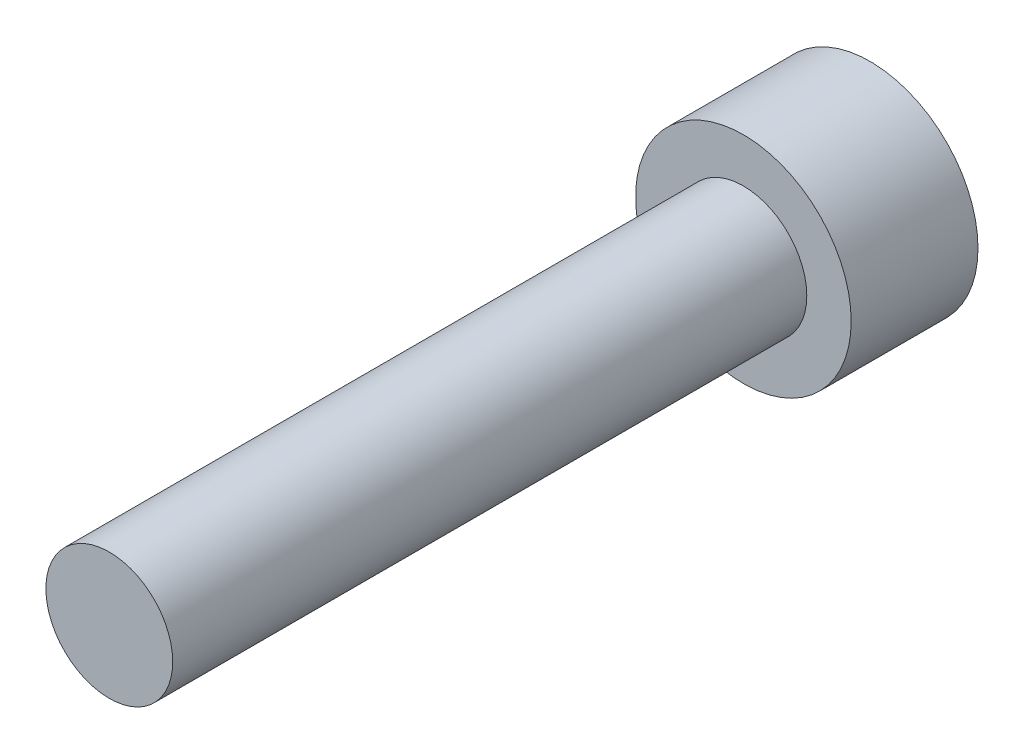
ISO-10303-21;
HEADER;
FILE_DESCRIPTION(('STEP AP214'),'2;1');
FILE_NAME('part.step','',(''),(''),'','','');
FILE_SCHEMA(('AUTOMOTIVE_DESIGN { 1 0 10303 214 1 1 1 1 }'));
ENDSEC;
DATA;
#1=APPLICATION_CONTEXT('core data for automotive mechanical design processes');
#2=APPLICATION_PROTOCOL_DEFINITION('international standard','automotive_design',2000,#1);
#3=PRODUCT_CONTEXT('',#1,'mechanical');
#4=PRODUCT('Part','Part','',(#3));
#5=PRODUCT_RELATED_PRODUCT_CATEGORY('part','',(#4));
#6=PRODUCT_DEFINITION_FORMATION('','',#4);
#7=PRODUCT_DEFINITION_CONTEXT('part definition',#1,'design');
#8=PRODUCT_DEFINITION('design','',#6,#7);
#9=PRODUCT_DEFINITION_SHAPE('','',#8);
#10=(LENGTH_UNIT() NAMED_UNIT(*) SI_UNIT(.MILLI.,.METRE.));
#11=(NAMED_UNIT(*) PLANE_ANGLE_UNIT() SI_UNIT($,.RADIAN.));
#12=(NAMED_UNIT(*) SI_UNIT($,.STERADIAN.) SOLID_ANGLE_UNIT());
#13=UNCERTAINTY_MEASURE_WITH_UNIT(LENGTH_MEASURE(1.E-05),#10,'distance_accuracy_value','');
#14=(GEOMETRIC_REPRESENTATION_CONTEXT(3) GLOBAL_UNCERTAINTY_ASSIGNED_CONTEXT((#13)) GLOBAL_UNIT_ASSIGNED_CONTEXT((#10,
#11,#12)) REPRESENTATION_CONTEXT('',''));
#15=CARTESIAN_POINT('',(0.,0.,0.));
#16=DIRECTION('',(0.,0.,1.));
#17=DIRECTION('',(1.,0.,0.));
#18=AXIS2_PLACEMENT_3D('',#15,#16,#17);
#19=CARTESIAN_POINT('',(0.,0.,0.));
#20=DIRECTION('',(0.,0.,1.));
#21=DIRECTION('',(1.,0.,0.));
#22=AXIS2_PLACEMENT_3D('',#19,#20,#21);
#23=PLANE('',#22);
#24=CARTESIAN_POINT('',(0.,0.,0.));
#25=DIRECTION('',(0.,0.,1.));
#26=DIRECTION('',(1.,0.,0.));
#27=AXIS2_PLACEMENT_3D('',#24,#25,#26);
#28=CIRCLE('',#27,4.25);
#29=CARTESIAN_POINT('',(4.25,0.,0.));
#30=VERTEX_POINT('',#29);
#31=EDGE_CURVE('E40',#30,#30,#28,.T.);
#32=ORIENTED_EDGE('',*,*,#31,.T.);
#33=EDGE_LOOP('',(#32));
#34=FACE_BOUND('',#33,.T.);
#35=CARTESIAN_POINT('',(0.,0.,0.));
#36=DIRECTION('',(0.,0.,1.));
#37=DIRECTION('',(1.,0.,0.));
#38=AXIS2_PLACEMENT_3D('',#35,#36,#37);
#39=CIRCLE('',#38,2.5);
#40=CARTESIAN_POINT('',(2.5,0.,0.));
#41=VERTEX_POINT('',#40);
#42=EDGE_CURVE('E49',#41,#41,#39,.T.);
#43=ORIENTED_EDGE('',*,*,#42,.F.);
#44=EDGE_LOOP('',(#43));
#45=FACE_BOUND('',#44,.T.);
#46=ADVANCED_FACE('F36',(#34,#45),#23,.T.);
#47=CARTESIAN_POINT('',(0.,0.,-5.));
#48=DIRECTION('',(0.,0.,1.));
#49=DIRECTION('',(1.,0.,0.));
#50=AXIS2_PLACEMENT_3D('',#47,#48,#49);
#51=CYLINDRICAL_SURFACE('',#50,4.25);
#52=CARTESIAN_POINT('',(0.,0.,-5.));
#53=DIRECTION('',(0.,0.,1.));
#54=DIRECTION('',(1.,0.,0.));
#55=AXIS2_PLACEMENT_3D('',#52,#53,#54);
#56=CIRCLE('',#55,4.25);
#57=CARTESIAN_POINT('',(4.25,0.,-5.));
#58=VERTEX_POINT('',#57);
#59=EDGE_CURVE('E10',#58,#58,#56,.T.);
#60=ORIENTED_EDGE('',*,*,#59,.T.);
#61=EDGE_LOOP('',(#60));
#62=FACE_BOUND('',#61,.T.);
#63=ORIENTED_EDGE('',*,*,#31,.F.);
#64=EDGE_LOOP('',(#63));
#65=FACE_BOUND('',#64,.T.);
#66=ADVANCED_FACE('F38',(#62,#65),#51,.T.);
#67=CARTESIAN_POINT('',(0.,0.,-5.));
#68=DIRECTION('',(0.,0.,1.));
#69=DIRECTION('',(1.,0.,0.));
#70=AXIS2_PLACEMENT_3D('',#67,#68,#69);
#71=PLANE('',#70);
#72=ORIENTED_EDGE('',*,*,#59,.F.);
#73=EDGE_LOOP('',(#72));
#74=FACE_BOUND('',#73,.T.);
#75=ADVANCED_FACE('F60',(#74),#71,.F.);
#76=CARTESIAN_POINT('',(0.,0.,25.));
#77=DIRECTION('',(0.,0.,-1.));
#78=DIRECTION('',(-1.,0.,0.));
#79=AXIS2_PLACEMENT_3D('',#76,#77,#78);
#80=CYLINDRICAL_SURFACE('',#79,2.5);
#81=CARTESIAN_POINT('',(0.,0.,25.));
#82=DIRECTION('',(0.,0.,1.));
#83=DIRECTION('',(1.,0.,0.));
#84=AXIS2_PLACEMENT_3D('',#81,#82,#83);
#85=CIRCLE('',#84,2.5);
#86=CARTESIAN_POINT('',(2.5,0.,25.));
#87=VERTEX_POINT('',#86);
#88=EDGE_CURVE('E47',#87,#87,#85,.T.);
#89=ORIENTED_EDGE('',*,*,#88,.F.);
#90=EDGE_LOOP('',(#89));
#91=FACE_BOUND('',#90,.T.);
#92=ORIENTED_EDGE('',*,*,#42,.T.);
#93=EDGE_LOOP('',(#92));
#94=FACE_BOUND('',#93,.T.);
#95=ADVANCED_FACE('F57',(#91,#94),#80,.T.);
#96=CARTESIAN_POINT('',(0.,0.,25.));
#97=DIRECTION('',(0.,0.,1.));
#98=DIRECTION('',(1.,0.,0.));
#99=AXIS2_PLACEMENT_3D('',#96,#97,#98);
#100=PLANE('',#99);
#101=ORIENTED_EDGE('',*,*,#88,.T.);
#102=EDGE_LOOP('',(#101));
#103=FACE_BOUND('',#102,.T.);
#104=ADVANCED_FACE('F55',(#103),#100,.T.);
#105=CLOSED_SHELL('',(#46,#66,#75,#95,#104));
#106=MANIFOLD_SOLID_BREP('B2',#105);
#107=ADVANCED_BREP_SHAPE_REPRESENTATION('',(#18,#106),#14);
#108=SHAPE_DEFINITION_REPRESENTATION(#9,#107);
ENDSEC;
END-ISO-10303-21;
